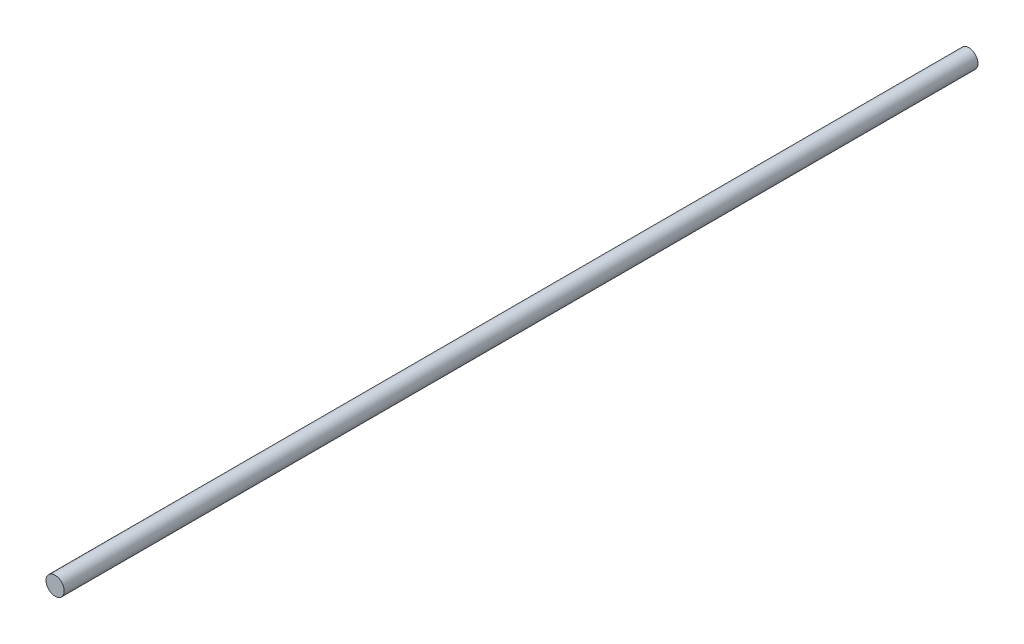
ISO-10303-21;
HEADER;
FILE_DESCRIPTION(('STEP AP214'),'2;1');
FILE_NAME('part.step','',(''),(''),'','','');
FILE_SCHEMA(('AUTOMOTIVE_DESIGN { 1 0 10303 214 1 1 1 1 }'));
ENDSEC;
DATA;
#1=APPLICATION_CONTEXT('core data for automotive mechanical design processes');
#2=APPLICATION_PROTOCOL_DEFINITION('international standard','automotive_design',2000,#1);
#3=PRODUCT_CONTEXT('',#1,'mechanical');
#4=PRODUCT('Part','Part','',(#3));
#5=PRODUCT_RELATED_PRODUCT_CATEGORY('part','',(#4));
#6=PRODUCT_DEFINITION_FORMATION('','',#4);
#7=PRODUCT_DEFINITION_CONTEXT('part definition',#1,'design');
#8=PRODUCT_DEFINITION('design','',#6,#7);
#9=PRODUCT_DEFINITION_SHAPE('','',#8);
#10=(LENGTH_UNIT() NAMED_UNIT(*) SI_UNIT(.MILLI.,.METRE.));
#11=(NAMED_UNIT(*) PLANE_ANGLE_UNIT() SI_UNIT($,.RADIAN.));
#12=(NAMED_UNIT(*) SI_UNIT($,.STERADIAN.) SOLID_ANGLE_UNIT());
#13=UNCERTAINTY_MEASURE_WITH_UNIT(LENGTH_MEASURE(1.E-05),#10,'distance_accuracy_value','');
#14=(GEOMETRIC_REPRESENTATION_CONTEXT(3) GLOBAL_UNCERTAINTY_ASSIGNED_CONTEXT((#13)) GLOBAL_UNIT_ASSIGNED_CONTEXT((#10,
#11,#12)) REPRESENTATION_CONTEXT('',''));
#15=CARTESIAN_POINT('',(0.,0.,0.));
#16=DIRECTION('',(0.,0.,1.));
#17=DIRECTION('',(1.,0.,0.));
#18=AXIS2_PLACEMENT_3D('',#15,#16,#17);
#19=CARTESIAN_POINT('',(0.,0.,150.));
#20=DIRECTION('',(0.,0.,-1.));
#21=DIRECTION('',(-1.,0.,0.));
#22=AXIS2_PLACEMENT_3D('',#19,#20,#21);
#23=CYLINDRICAL_SURFACE('',#22,1.5);
#24=CARTESIAN_POINT('',(0.,0.,150.));
#25=DIRECTION('',(0.,0.,1.));
#26=DIRECTION('',(1.,0.,0.));
#27=AXIS2_PLACEMENT_3D('',#24,#25,#26);
#28=CIRCLE('',#27,1.5);
#29=CARTESIAN_POINT('',(1.5,0.,150.));
#30=VERTEX_POINT('',#29);
#31=EDGE_CURVE('E10',#30,#30,#28,.T.);
#32=ORIENTED_EDGE('',*,*,#31,.F.);
#33=EDGE_LOOP('',(#32));
#34=FACE_BOUND('',#33,.T.);
#35=CARTESIAN_POINT('',(0.,0.,0.));
#36=DIRECTION('',(0.,0.,1.));
#37=DIRECTION('',(1.,0.,0.));
#38=AXIS2_PLACEMENT_3D('',#35,#36,#37);
#39=CIRCLE('',#38,1.5);
#40=CARTESIAN_POINT('',(1.5,0.,0.));
#41=VERTEX_POINT('',#40);
#42=EDGE_CURVE('E41',#41,#41,#39,.T.);
#43=ORIENTED_EDGE('',*,*,#42,.T.);
#44=EDGE_LOOP('',(#43));
#45=FACE_BOUND('',#44,.T.);
#46=ADVANCED_FACE('F38',(#34,#45),#23,.T.);
#47=CARTESIAN_POINT('',(0.,0.,150.));
#48=DIRECTION('',(0.,0.,1.));
#49=DIRECTION('',(1.,0.,0.));
#50=AXIS2_PLACEMENT_3D('',#47,#48,#49);
#51=PLANE('',#50);
#52=ORIENTED_EDGE('',*,*,#31,.T.);
#53=EDGE_LOOP('',(#52));
#54=FACE_BOUND('',#53,.T.);
#55=ADVANCED_FACE('F55',(#54),#51,.T.);
#56=CARTESIAN_POINT('',(0.,0.,0.));
#57=DIRECTION('',(0.,0.,1.));
#58=DIRECTION('',(1.,0.,0.));
#59=AXIS2_PLACEMENT_3D('',#56,#57,#58);
#60=PLANE('',#59);
#61=ORIENTED_EDGE('',*,*,#42,.F.);
#62=EDGE_LOOP('',(#61));
#63=FACE_BOUND('',#62,.T.);
#64=ADVANCED_FACE('F53',(#63),#60,.F.);
#65=CLOSED_SHELL('',(#46,#55,#64));
#66=MANIFOLD_SOLID_BREP('B2',#65);
#67=ADVANCED_BREP_SHAPE_REPRESENTATION('',(#18,#66),#14);
#68=SHAPE_DEFINITION_REPRESENTATION(#9,#67);
ENDSEC;
END-ISO-10303-21;
